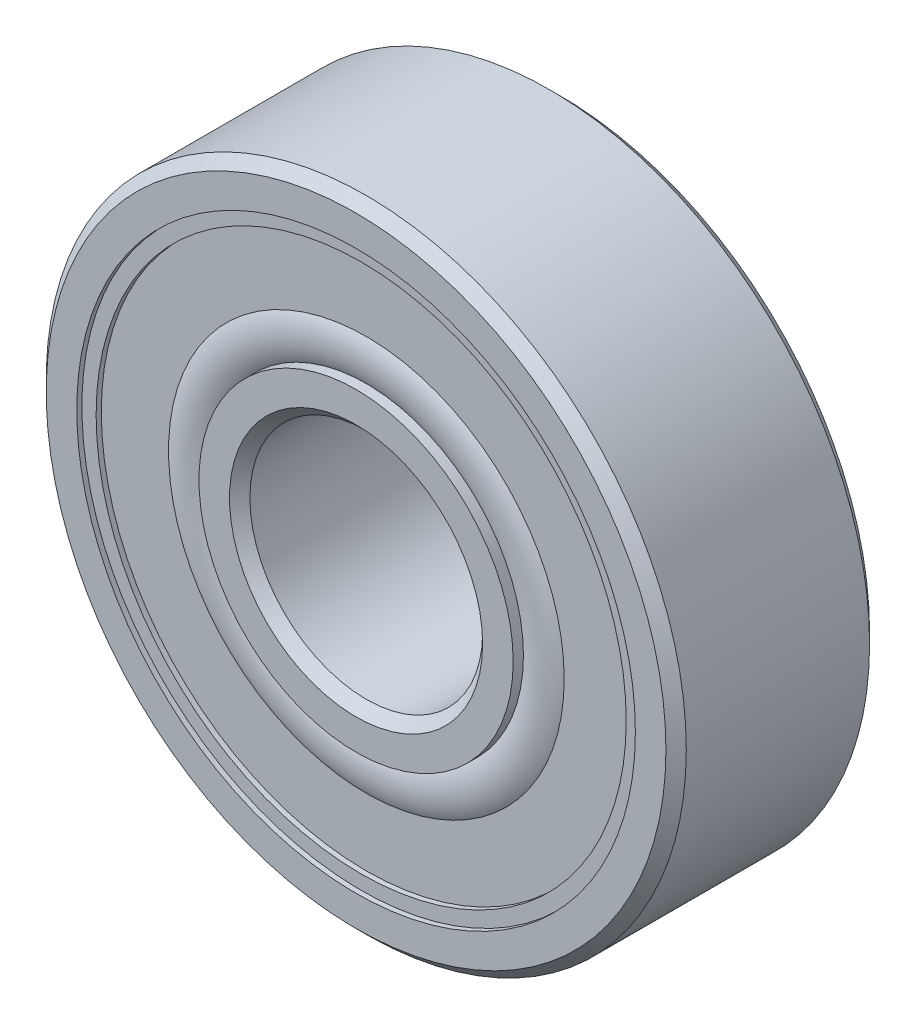
ISO-10303-21;
HEADER;
FILE_DESCRIPTION(('STEP AP214'),'2;1');
FILE_NAME('part.step','',(''),(''),'','','');
FILE_SCHEMA(('AUTOMOTIVE_DESIGN { 1 0 10303 214 1 1 1 1 }'));
ENDSEC;
DATA;
#1=APPLICATION_CONTEXT('core data for automotive mechanical design processes');
#2=APPLICATION_PROTOCOL_DEFINITION('international standard','automotive_design',2000,#1);
#3=PRODUCT_CONTEXT('',#1,'mechanical');
#4=PRODUCT('Part','Part','',(#3));
#5=PRODUCT_RELATED_PRODUCT_CATEGORY('part','',(#4));
#6=PRODUCT_DEFINITION_FORMATION('','',#4);
#7=PRODUCT_DEFINITION_CONTEXT('part definition',#1,'design');
#8=PRODUCT_DEFINITION('design','',#6,#7);
#9=PRODUCT_DEFINITION_SHAPE('','',#8);
#10=(LENGTH_UNIT() NAMED_UNIT(*) SI_UNIT(.MILLI.,.METRE.));
#11=(NAMED_UNIT(*) PLANE_ANGLE_UNIT() SI_UNIT($,.RADIAN.));
#12=(NAMED_UNIT(*) SI_UNIT($,.STERADIAN.) SOLID_ANGLE_UNIT());
#13=UNCERTAINTY_MEASURE_WITH_UNIT(LENGTH_MEASURE(1.E-05),#10,'distance_accuracy_value','');
#14=(GEOMETRIC_REPRESENTATION_CONTEXT(3) GLOBAL_UNCERTAINTY_ASSIGNED_CONTEXT((#13)) GLOBAL_UNIT_ASSIGNED_CONTEXT((#10,
#11,#12)) REPRESENTATION_CONTEXT('',''));
#15=CARTESIAN_POINT('',(0.,0.,0.));
#16=DIRECTION('',(0.,0.,1.));
#17=DIRECTION('',(1.,0.,0.));
#18=AXIS2_PLACEMENT_3D('',#15,#16,#17);
#19=CARTESIAN_POINT('',(0.,0.,-1.85890868663651));
#20=DIRECTION('',(0.,0.,1.));
#21=DIRECTION('',(1.,0.,0.));
#22=AXIS2_PLACEMENT_3D('',#19,#20,#21);
#23=TOROIDAL_SURFACE('',#22,6.10000000000001,1.46609131336349);
#24=CARTESIAN_POINT('',(0.,0.,-3.14709490730489));
#25=DIRECTION('',(0.,0.,1.));
#26=DIRECTION('',(1.,0.,0.));
#27=AXIS2_PLACEMENT_3D('',#24,#25,#26);
#28=CIRCLE('',#27,6.80000000000001);
#29=CARTESIAN_POINT('',(6.80000000000001,0.,-3.14709490730489));
#30=VERTEX_POINT('',#29);
#31=EDGE_CURVE('E11',#30,#30,#28,.T.);
#32=ORIENTED_EDGE('',*,*,#31,.F.);
#33=EDGE_LOOP('',(#32));
#34=FACE_BOUND('',#33,.T.);
#35=CARTESIAN_POINT('',(0.,0.,-3.14709490730489));
#36=DIRECTION('',(0.,0.,1.));
#37=DIRECTION('',(1.,0.,0.));
#38=AXIS2_PLACEMENT_3D('',#35,#36,#37);
#39=CIRCLE('',#38,5.40000000000001);
#40=CARTESIAN_POINT('',(5.40000000000001,0.,-3.14709490730489));
#41=VERTEX_POINT('',#40);
#42=EDGE_CURVE('E71',#41,#41,#39,.T.);
#43=ORIENTED_EDGE('',*,*,#42,.T.);
#44=EDGE_LOOP('',(#43));
#45=FACE_BOUND('',#44,.T.);
#46=ADVANCED_FACE('F46',(#34,#45),#23,.T.);
#47=CARTESIAN_POINT('',(0.,9.10999999999999,-3.14709490730489));
#48=DIRECTION('',(0.,0.,1.));
#49=DIRECTION('',(1.,0.,0.));
#50=AXIS2_PLACEMENT_3D('',#47,#48,#49);
#51=PLANE('',#50);
#52=CARTESIAN_POINT('',(0.,0.,-3.14709490730489));
#53=DIRECTION('',(0.,0.,1.));
#54=DIRECTION('',(1.,0.,0.));
#55=AXIS2_PLACEMENT_3D('',#52,#53,#54);
#56=CIRCLE('',#55,9.10999999999999);
#57=CARTESIAN_POINT('',(9.10999999999999,0.,-3.14709490730489));
#58=VERTEX_POINT('',#57);
#59=EDGE_CURVE('E52',#58,#58,#56,.T.);
#60=ORIENTED_EDGE('',*,*,#59,.F.);
#61=EDGE_LOOP('',(#60));
#62=FACE_BOUND('',#61,.T.);
#63=ORIENTED_EDGE('',*,*,#31,.T.);
#64=EDGE_LOOP('',(#63));
#65=FACE_BOUND('',#64,.T.);
#66=ADVANCED_FACE('F102',(#62,#65),#51,.F.);
#67=CARTESIAN_POINT('',(0.,0.,3.5));
#68=DIRECTION('',(0.,0.,1.));
#69=DIRECTION('',(1.,0.,0.));
#70=AXIS2_PLACEMENT_3D('',#67,#68,#69);
#71=CYLINDRICAL_SURFACE('',#70,9.10999999999999);
#72=CARTESIAN_POINT('',(0.,0.,-3.325));
#73=DIRECTION('',(0.,0.,1.));
#74=DIRECTION('',(1.,0.,0.));
#75=AXIS2_PLACEMENT_3D('',#72,#73,#74);
#76=CIRCLE('',#75,9.10999999999999);
#77=CARTESIAN_POINT('',(9.10999999999999,0.,-3.325));
#78=VERTEX_POINT('',#77);
#79=EDGE_CURVE('E56',#78,#78,#76,.T.);
#80=ORIENTED_EDGE('',*,*,#79,.F.);
#81=EDGE_LOOP('',(#80));
#82=FACE_BOUND('',#81,.T.);
#83=ORIENTED_EDGE('',*,*,#59,.T.);
#84=EDGE_LOOP('',(#83));
#85=FACE_BOUND('',#84,.T.);
#86=ADVANCED_FACE('F97',(#82,#85),#71,.F.);
#87=CARTESIAN_POINT('',(0.,9.59999999999999,-3.325));
#88=DIRECTION('',(0.,0.,1.));
#89=DIRECTION('',(1.,0.,0.));
#90=AXIS2_PLACEMENT_3D('',#87,#88,#89);
#91=PLANE('',#90);
#92=CARTESIAN_POINT('',(0.,0.,-3.325));
#93=DIRECTION('',(0.,0.,1.));
#94=DIRECTION('',(1.,0.,0.));
#95=AXIS2_PLACEMENT_3D('',#92,#93,#94);
#96=CIRCLE('',#95,9.59999999999999);
#97=CARTESIAN_POINT('',(9.59999999999999,0.,-3.325));
#98=VERTEX_POINT('',#97);
#99=EDGE_CURVE('E60',#98,#98,#96,.T.);
#100=ORIENTED_EDGE('',*,*,#99,.F.);
#101=EDGE_LOOP('',(#100));
#102=FACE_BOUND('',#101,.T.);
#103=ORIENTED_EDGE('',*,*,#79,.T.);
#104=EDGE_LOOP('',(#103));
#105=FACE_BOUND('',#104,.T.);
#106=ADVANCED_FACE('F91',(#102,#105),#91,.F.);
#107=CARTESIAN_POINT('',(0.,0.,3.5));
#108=DIRECTION('',(0.,0.,1.));
#109=DIRECTION('',(1.,0.,0.));
#110=AXIS2_PLACEMENT_3D('',#107,#108,#109);
#111=CYLINDRICAL_SURFACE('',#110,9.59999999999999);
#112=CARTESIAN_POINT('',(0.,0.,-2.61337962921956));
#113=DIRECTION('',(0.,0.,1.));
#114=DIRECTION('',(1.,0.,0.));
#115=AXIS2_PLACEMENT_3D('',#112,#113,#114);
#116=CIRCLE('',#115,9.59999999999999);
#117=CARTESIAN_POINT('',(9.59999999999999,0.,-2.61337962921956));
#118=VERTEX_POINT('',#117);
#119=EDGE_CURVE('E65',#118,#118,#116,.T.);
#120=ORIENTED_EDGE('',*,*,#119,.F.);
#121=EDGE_LOOP('',(#120));
#122=FACE_BOUND('',#121,.T.);
#123=ORIENTED_EDGE('',*,*,#99,.T.);
#124=EDGE_LOOP('',(#123));
#125=FACE_BOUND('',#124,.T.);
#126=ADVANCED_FACE('F85',(#122,#125),#111,.T.);
#127=CARTESIAN_POINT('',(0.,9.59999999999999,-2.61337962921956));
#128=DIRECTION('',(0.,0.,-1.));
#129=DIRECTION('',(-1.,0.,0.));
#130=AXIS2_PLACEMENT_3D('',#127,#128,#129);
#131=PLANE('',#130);
#132=CARTESIAN_POINT('',(0.,0.,-2.61337962921956));
#133=DIRECTION('',(0.,0.,1.));
#134=DIRECTION('',(1.,0.,0.));
#135=AXIS2_PLACEMENT_3D('',#132,#133,#134);
#136=CIRCLE('',#135,5.40000000000001);
#137=CARTESIAN_POINT('',(5.40000000000001,0.,-2.61337962921956));
#138=VERTEX_POINT('',#137);
#139=EDGE_CURVE('E68',#138,#138,#136,.T.);
#140=ORIENTED_EDGE('',*,*,#139,.F.);
#141=EDGE_LOOP('',(#140));
#142=FACE_BOUND('',#141,.T.);
#143=ORIENTED_EDGE('',*,*,#119,.T.);
#144=EDGE_LOOP('',(#143));
#145=FACE_BOUND('',#144,.T.);
#146=ADVANCED_FACE('F79',(#142,#145),#131,.F.);
#147=CARTESIAN_POINT('',(0.,0.,3.5));
#148=DIRECTION('',(0.,0.,1.));
#149=DIRECTION('',(1.,0.,0.));
#150=AXIS2_PLACEMENT_3D('',#147,#148,#149);
#151=CYLINDRICAL_SURFACE('',#150,5.40000000000001);
#152=ORIENTED_EDGE('',*,*,#42,.F.);
#153=EDGE_LOOP('',(#152));
#154=FACE_BOUND('',#153,.T.);
#155=ORIENTED_EDGE('',*,*,#139,.T.);
#156=EDGE_LOOP('',(#155));
#157=FACE_BOUND('',#156,.T.);
#158=ADVANCED_FACE('F76',(#154,#157),#151,.F.);
#159=CLOSED_SHELL('',(#46,#66,#86,#106,#126,#146,#158));
#160=MANIFOLD_SOLID_BREP('B2',#159);
#161=CARTESIAN_POINT('',(0.,9.59999999999999,3.325));
#162=DIRECTION('',(0.,0.,-1.));
#163=DIRECTION('',(-1.,0.,0.));
#164=AXIS2_PLACEMENT_3D('',#161,#162,#163);
#165=PLANE('',#164);
#166=CARTESIAN_POINT('',(0.,0.,3.325));
#167=DIRECTION('',(0.,0.,1.));
#168=DIRECTION('',(1.,0.,0.));
#169=AXIS2_PLACEMENT_3D('',#166,#167,#168);
#170=CIRCLE('',#169,9.10999999999999);
#171=CARTESIAN_POINT('',(9.10999999999999,0.,3.325));
#172=VERTEX_POINT('',#171);
#173=EDGE_CURVE('E170',#172,#172,#170,.T.);
#174=ORIENTED_EDGE('',*,*,#173,.F.);
#175=EDGE_LOOP('',(#174));
#176=FACE_BOUND('',#175,.T.);
#177=CARTESIAN_POINT('',(0.,0.,3.325));
#178=DIRECTION('',(0.,0.,1.));
#179=DIRECTION('',(1.,0.,0.));
#180=AXIS2_PLACEMENT_3D('',#177,#178,#179);
#181=CIRCLE('',#180,9.59999999999999);
#182=CARTESIAN_POINT('',(9.59999999999999,0.,3.325));
#183=VERTEX_POINT('',#182);
#184=EDGE_CURVE('E45',#183,#183,#181,.T.);
#185=ORIENTED_EDGE('',*,*,#184,.T.);
#186=EDGE_LOOP('',(#185));
#187=FACE_BOUND('',#186,.T.);
#188=ADVANCED_FACE('F145',(#176,#187),#165,.F.);
#189=CARTESIAN_POINT('',(0.,0.,3.5));
#190=DIRECTION('',(0.,0.,1.));
#191=DIRECTION('',(1.,0.,0.));
#192=AXIS2_PLACEMENT_3D('',#189,#190,#191);
#193=CYLINDRICAL_SURFACE('',#192,9.59999999999999);
#194=ORIENTED_EDGE('',*,*,#184,.F.);
#195=EDGE_LOOP('',(#194));
#196=FACE_BOUND('',#195,.T.);
#197=CARTESIAN_POINT('',(0.,0.,2.61337962921956));
#198=DIRECTION('',(0.,0.,1.));
#199=DIRECTION('',(1.,0.,0.));
#200=AXIS2_PLACEMENT_3D('',#197,#198,#199);
#201=CIRCLE('',#200,9.59999999999999);
#202=CARTESIAN_POINT('',(9.59999999999999,0.,2.61337962921956));
#203=VERTEX_POINT('',#202);
#204=EDGE_CURVE('E151',#203,#203,#201,.T.);
#205=ORIENTED_EDGE('',*,*,#204,.T.);
#206=EDGE_LOOP('',(#205));
#207=FACE_BOUND('',#206,.T.);
#208=ADVANCED_FACE('F177',(#196,#207),#193,.T.);
#209=CARTESIAN_POINT('',(0.,9.59999999999999,2.61337962921956));
#210=DIRECTION('',(0.,0.,1.));
#211=DIRECTION('',(1.,0.,0.));
#212=AXIS2_PLACEMENT_3D('',#209,#210,#211);
#213=PLANE('',#212);
#214=ORIENTED_EDGE('',*,*,#204,.F.);
#215=EDGE_LOOP('',(#214));
#216=FACE_BOUND('',#215,.T.);
#217=CARTESIAN_POINT('',(0.,0.,2.61337962921956));
#218=DIRECTION('',(0.,0.,1.));
#219=DIRECTION('',(1.,0.,0.));
#220=AXIS2_PLACEMENT_3D('',#217,#218,#219);
#221=CIRCLE('',#220,5.40000000000001);
#222=CARTESIAN_POINT('',(5.40000000000001,0.,2.61337962921956));
#223=VERTEX_POINT('',#222);
#224=EDGE_CURVE('E155',#223,#223,#221,.T.);
#225=ORIENTED_EDGE('',*,*,#224,.T.);
#226=EDGE_LOOP('',(#225));
#227=FACE_BOUND('',#226,.T.);
#228=ADVANCED_FACE('F181',(#216,#227),#213,.F.);
#229=CARTESIAN_POINT('',(0.,0.,3.5));
#230=DIRECTION('',(0.,0.,1.));
#231=DIRECTION('',(1.,0.,0.));
#232=AXIS2_PLACEMENT_3D('',#229,#230,#231);
#233=CYLINDRICAL_SURFACE('',#232,5.40000000000001);
#234=ORIENTED_EDGE('',*,*,#224,.F.);
#235=EDGE_LOOP('',(#234));
#236=FACE_BOUND('',#235,.T.);
#237=CARTESIAN_POINT('',(0.,0.,3.14709490730489));
#238=DIRECTION('',(0.,0.,1.));
#239=DIRECTION('',(1.,0.,0.));
#240=AXIS2_PLACEMENT_3D('',#237,#238,#239);
#241=CIRCLE('',#240,5.40000000000001);
#242=CARTESIAN_POINT('',(5.40000000000001,0.,3.14709490730489));
#243=VERTEX_POINT('',#242);
#244=EDGE_CURVE('E159',#243,#243,#241,.T.);
#245=ORIENTED_EDGE('',*,*,#244,.T.);
#246=EDGE_LOOP('',(#245));
#247=FACE_BOUND('',#246,.T.);
#248=ADVANCED_FACE('F186',(#236,#247),#233,.F.);
#249=CARTESIAN_POINT('',(0.,0.,1.85890868663651));
#250=DIRECTION('',(0.,0.,1.));
#251=DIRECTION('',(1.,0.,0.));
#252=AXIS2_PLACEMENT_3D('',#249,#250,#251);
#253=TOROIDAL_SURFACE('',#252,6.10000000000001,1.46609131336349);
#254=ORIENTED_EDGE('',*,*,#244,.F.);
#255=EDGE_LOOP('',(#254));
#256=FACE_BOUND('',#255,.T.);
#257=CARTESIAN_POINT('',(0.,0.,3.14709490730489));
#258=DIRECTION('',(0.,0.,1.));
#259=DIRECTION('',(1.,0.,0.));
#260=AXIS2_PLACEMENT_3D('',#257,#258,#259);
#261=CIRCLE('',#260,6.80000000000001);
#262=CARTESIAN_POINT('',(6.80000000000001,0.,3.14709490730489));
#263=VERTEX_POINT('',#262);
#264=EDGE_CURVE('E164',#263,#263,#261,.T.);
#265=ORIENTED_EDGE('',*,*,#264,.T.);
#266=EDGE_LOOP('',(#265));
#267=FACE_BOUND('',#266,.T.);
#268=ADVANCED_FACE('F192',(#256,#267),#253,.T.);
#269=CARTESIAN_POINT('',(0.,9.10999999999999,3.14709490730489));
#270=DIRECTION('',(0.,0.,-1.));
#271=DIRECTION('',(-1.,0.,0.));
#272=AXIS2_PLACEMENT_3D('',#269,#270,#271);
#273=PLANE('',#272);
#274=ORIENTED_EDGE('',*,*,#264,.F.);
#275=EDGE_LOOP('',(#274));
#276=FACE_BOUND('',#275,.T.);
#277=CARTESIAN_POINT('',(0.,0.,3.14709490730489));
#278=DIRECTION('',(0.,0.,1.));
#279=DIRECTION('',(1.,0.,0.));
#280=AXIS2_PLACEMENT_3D('',#277,#278,#279);
#281=CIRCLE('',#280,9.10999999999999);
#282=CARTESIAN_POINT('',(9.10999999999999,0.,3.14709490730489));
#283=VERTEX_POINT('',#282);
#284=EDGE_CURVE('E167',#283,#283,#281,.T.);
#285=ORIENTED_EDGE('',*,*,#284,.T.);
#286=EDGE_LOOP('',(#285));
#287=FACE_BOUND('',#286,.T.);
#288=ADVANCED_FACE('F196',(#276,#287),#273,.F.);
#289=CARTESIAN_POINT('',(0.,0.,3.5));
#290=DIRECTION('',(0.,0.,1.));
#291=DIRECTION('',(1.,0.,0.));
#292=AXIS2_PLACEMENT_3D('',#289,#290,#291);
#293=CYLINDRICAL_SURFACE('',#292,9.10999999999999);
#294=ORIENTED_EDGE('',*,*,#284,.F.);
#295=EDGE_LOOP('',(#294));
#296=FACE_BOUND('',#295,.T.);
#297=ORIENTED_EDGE('',*,*,#173,.T.);
#298=EDGE_LOOP('',(#297));
#299=FACE_BOUND('',#298,.T.);
#300=ADVANCED_FACE('F174',(#296,#299),#293,.F.);
#301=CLOSED_SHELL('',(#188,#208,#228,#248,#268,#288,#300));
#302=MANIFOLD_SOLID_BREP('B6',#301);
#303=CARTESIAN_POINT('',(-5.86373611851017,4.67617351394057,0.));
#304=DIRECTION('',(0.,0.,1.));
#305=DIRECTION('',(-0.781831482468022,0.623489801858743,0.));
#306=AXIS2_PLACEMENT_3D('',#303,#304,#305);
#307=SPHERICAL_SURFACE('',#306,2.61337962921956);
#308=CARTESIAN_POINT('',(-5.86373611851017,4.67617351394057,2.61337962921956));
#309=VERTEX_POINT('',#308);
#310=VERTEX_LOOP('',#309);
#311=FACE_BOUND('',#310,.T.);
#312=ADVANCED_FACE('F244',(#311),#307,.T.);
#313=CLOSED_SHELL('',(#312));
#314=MANIFOLD_SOLID_BREP('B40',#313);
#315=CARTESIAN_POINT('',(-7.31195934136369,-1.66890700467229,0.));
#316=DIRECTION('',(0.,0.,1.));
#317=DIRECTION('',(-0.974927912181826,-0.222520933956305,0.));
#318=AXIS2_PLACEMENT_3D('',#315,#316,#317);
#319=SPHERICAL_SURFACE('',#318,2.61337962921956);
#320=CARTESIAN_POINT('',(-7.31195934136369,-1.66890700467229,2.61337962921956));
#321=VERTEX_POINT('',#320);
#322=VERTEX_LOOP('',#321);
#323=FACE_BOUND('',#322,.T.);
#324=ADVANCED_FACE('F261',(#323),#319,.T.);
#325=CLOSED_SHELL('',(#324));
#326=MANIFOLD_SOLID_BREP('B141',#325);
#327=CARTESIAN_POINT('',(-3.25412804338174,-6.75726650926812,0.));
#328=DIRECTION('',(0.,0.,1.));
#329=DIRECTION('',(-0.433883739117565,-0.900968867902416,0.));
#330=AXIS2_PLACEMENT_3D('',#327,#328,#329);
#331=SPHERICAL_SURFACE('',#330,2.61337962921956);
#332=CARTESIAN_POINT('',(-3.25412804338174,-6.75726650926812,2.61337962921956));
#333=VERTEX_POINT('',#332);
#334=VERTEX_LOOP('',#333);
#335=FACE_BOUND('',#334,.T.);
#336=ADVANCED_FACE('F278',(#335),#331,.T.);
#337=CLOSED_SHELL('',(#336));
#338=MANIFOLD_SOLID_BREP('B240',#337);
#339=CARTESIAN_POINT('',(3.25412804338164,-6.75726650926816,0.));
#340=DIRECTION('',(0.,0.,1.));
#341=DIRECTION('',(0.433883739117553,-0.900968867902422,0.));
#342=AXIS2_PLACEMENT_3D('',#339,#340,#341);
#343=SPHERICAL_SURFACE('',#342,2.61337962921956);
#344=CARTESIAN_POINT('',(3.25412804338164,-6.75726650926816,2.61337962921956));
#345=VERTEX_POINT('',#344);
#346=VERTEX_LOOP('',#345);
#347=FACE_BOUND('',#346,.T.);
#348=ADVANCED_FACE('F295',(#347),#343,.T.);
#349=CLOSED_SHELL('',(#348));
#350=MANIFOLD_SOLID_BREP('B257',#349);
#351=CARTESIAN_POINT('',(7.31195934136367,-1.66890700467239,0.));
#352=DIRECTION('',(0.,0.,1.));
#353=DIRECTION('',(0.974927912181823,-0.222520933956318,0.));
#354=AXIS2_PLACEMENT_3D('',#351,#352,#353);
#355=SPHERICAL_SURFACE('',#354,2.61337962921956);
#356=CARTESIAN_POINT('',(7.31195934136367,-1.66890700467239,2.61337962921956));
#357=VERTEX_POINT('',#356);
#358=VERTEX_LOOP('',#357);
#359=FACE_BOUND('',#358,.T.);
#360=ADVANCED_FACE('F312',(#359),#355,.T.);
#361=CLOSED_SHELL('',(#360));
#362=MANIFOLD_SOLID_BREP('B274',#361);
#363=CARTESIAN_POINT('',(5.86373611851023,4.67617351394049,0.));
#364=DIRECTION('',(0.,0.,1.));
#365=DIRECTION('',(0.781831482468031,0.623489801858732,0.));
#366=AXIS2_PLACEMENT_3D('',#363,#364,#365);
#367=SPHERICAL_SURFACE('',#366,2.61337962921956);
#368=CARTESIAN_POINT('',(5.86373611851023,4.67617351394049,2.61337962921956));
#369=VERTEX_POINT('',#368);
#370=VERTEX_LOOP('',#369);
#371=FACE_BOUND('',#370,.T.);
#372=ADVANCED_FACE('F329',(#371),#367,.T.);
#373=CLOSED_SHELL('',(#372));
#374=MANIFOLD_SOLID_BREP('B291',#373);
#375=CARTESIAN_POINT('',(0.,7.5,0.));
#376=DIRECTION('',(0.,0.,1.));
#377=DIRECTION('',(0.,1.,0.));
#378=AXIS2_PLACEMENT_3D('',#375,#376,#377);
#379=SPHERICAL_SURFACE('',#378,2.61337962921956);
#380=CARTESIAN_POINT('',(0.,7.5,2.61337962921956));
#381=VERTEX_POINT('',#380);
#382=VERTEX_LOOP('',#381);
#383=FACE_BOUND('',#382,.T.);
#384=ADVANCED_FACE('F348',(#383),#379,.T.);
#385=CLOSED_SHELL('',(#384));
#386=MANIFOLD_SOLID_BREP('B308',#385);
#387=CARTESIAN_POINT('',(0.,0.,3.5));
#388=DIRECTION('',(0.,0.,1.));
#389=DIRECTION('',(1.,0.,0.));
#390=AXIS2_PLACEMENT_3D('',#387,#388,#389);
#391=CONICAL_SURFACE('',#390,4.35,0.785398163397449);
#392=CARTESIAN_POINT('',(0.,0.,3.15));
#393=DIRECTION('',(0.,0.,1.));
#394=DIRECTION('',(1.,0.,0.));
#395=AXIS2_PLACEMENT_3D('',#392,#393,#394);
#396=CIRCLE('',#395,4.);
#397=CARTESIAN_POINT('',(4.,0.,3.15));
#398=VERTEX_POINT('',#397);
#399=EDGE_CURVE('E347',#398,#398,#396,.T.);
#400=ORIENTED_EDGE('',*,*,#399,.F.);
#401=EDGE_LOOP('',(#400));
#402=FACE_BOUND('',#401,.T.);
#403=CARTESIAN_POINT('',(0.,0.,3.5));
#404=DIRECTION('',(0.,0.,1.));
#405=DIRECTION('',(1.,0.,0.));
#406=AXIS2_PLACEMENT_3D('',#403,#404,#405);
#407=CIRCLE('',#406,4.35);
#408=CARTESIAN_POINT('',(4.35,0.,3.5));
#409=VERTEX_POINT('',#408);
#410=EDGE_CURVE('E394',#409,#409,#407,.T.);
#411=ORIENTED_EDGE('',*,*,#410,.T.);
#412=EDGE_LOOP('',(#411));
#413=FACE_BOUND('',#412,.T.);
#414=ADVANCED_FACE('F366',(#402,#413),#391,.F.);
#415=CARTESIAN_POINT('',(0.,0.,3.5));
#416=DIRECTION('',(0.,0.,1.));
#417=DIRECTION('',(1.,0.,0.));
#418=AXIS2_PLACEMENT_3D('',#415,#416,#417);
#419=CYLINDRICAL_SURFACE('',#418,4.);
#420=CARTESIAN_POINT('',(0.,0.,-3.15));
#421=DIRECTION('',(0.,0.,1.));
#422=DIRECTION('',(1.,0.,0.));
#423=AXIS2_PLACEMENT_3D('',#420,#421,#422);
#424=CIRCLE('',#423,4.);
#425=CARTESIAN_POINT('',(4.,0.,-3.15));
#426=VERTEX_POINT('',#425);
#427=EDGE_CURVE('E372',#426,#426,#424,.T.);
#428=ORIENTED_EDGE('',*,*,#427,.F.);
#429=EDGE_LOOP('',(#428));
#430=FACE_BOUND('',#429,.T.);
#431=ORIENTED_EDGE('',*,*,#399,.T.);
#432=EDGE_LOOP('',(#431));
#433=FACE_BOUND('',#432,.T.);
#434=ADVANCED_FACE('F431',(#430,#433),#419,.F.);
#435=CARTESIAN_POINT('',(0.,0.,-3.15));
#436=DIRECTION('',(0.,0.,-1.));
#437=DIRECTION('',(-1.,0.,0.));
#438=AXIS2_PLACEMENT_3D('',#435,#436,#437);
#439=CONICAL_SURFACE('',#438,4.,0.785398163397447);
#440=CARTESIAN_POINT('',(0.,0.,-3.5));
#441=DIRECTION('',(0.,0.,1.));
#442=DIRECTION('',(1.,0.,0.));
#443=AXIS2_PLACEMENT_3D('',#440,#441,#442);
#444=CIRCLE('',#443,4.35);
#445=CARTESIAN_POINT('',(4.35,0.,-3.5));
#446=VERTEX_POINT('',#445);
#447=EDGE_CURVE('E376',#446,#446,#444,.T.);
#448=ORIENTED_EDGE('',*,*,#447,.F.);
#449=EDGE_LOOP('',(#448));
#450=FACE_BOUND('',#449,.T.);
#451=ORIENTED_EDGE('',*,*,#427,.T.);
#452=EDGE_LOOP('',(#451));
#453=FACE_BOUND('',#452,.T.);
#454=ADVANCED_FACE('F426',(#450,#453),#439,.F.);
#455=CARTESIAN_POINT('',(0.,4.35,-3.5));
#456=DIRECTION('',(0.,0.,1.));
#457=DIRECTION('',(1.,0.,0.));
#458=AXIS2_PLACEMENT_3D('',#455,#456,#457);
#459=PLANE('',#458);
#460=CARTESIAN_POINT('',(0.,0.,-3.5));
#461=DIRECTION('',(0.,0.,1.));
#462=DIRECTION('',(1.,0.,0.));
#463=AXIS2_PLACEMENT_3D('',#460,#461,#462);
#464=CIRCLE('',#463,5.40000000000001);
#465=CARTESIAN_POINT('',(5.40000000000001,0.,-3.5));
#466=VERTEX_POINT('',#465);
#467=EDGE_CURVE('E380',#466,#466,#464,.T.);
#468=ORIENTED_EDGE('',*,*,#467,.F.);
#469=EDGE_LOOP('',(#468));
#470=FACE_BOUND('',#469,.T.);
#471=ORIENTED_EDGE('',*,*,#447,.T.);
#472=EDGE_LOOP('',(#471));
#473=FACE_BOUND('',#472,.T.);
#474=ADVANCED_FACE('F420',(#470,#473),#459,.F.);
#475=CARTESIAN_POINT('',(0.,0.,3.5));
#476=DIRECTION('',(0.,0.,1.));
#477=DIRECTION('',(1.,0.,0.));
#478=AXIS2_PLACEMENT_3D('',#475,#476,#477);
#479=CYLINDRICAL_SURFACE('',#478,5.4);
#480=CARTESIAN_POINT('',(0.,0.,-1.55555555555556));
#481=DIRECTION('',(0.,0.,1.));
#482=DIRECTION('',(1.,0.,0.));
#483=AXIS2_PLACEMENT_3D('',#480,#481,#482);
#484=CIRCLE('',#483,5.4);
#485=CARTESIAN_POINT('',(5.4,0.,-1.55555555555556));
#486=VERTEX_POINT('',#485);
#487=EDGE_CURVE('E385',#486,#486,#484,.T.);
#488=ORIENTED_EDGE('',*,*,#487,.F.);
#489=EDGE_LOOP('',(#488));
#490=FACE_BOUND('',#489,.T.);
#491=ORIENTED_EDGE('',*,*,#467,.T.);
#492=EDGE_LOOP('',(#491));
#493=FACE_BOUND('',#492,.T.);
#494=ADVANCED_FACE('F414',(#490,#493),#479,.T.);
#495=CARTESIAN_POINT('',(0.,0.,0.));
#496=DIRECTION('',(0.,0.,1.));
#497=DIRECTION('',(1.,0.,0.));
#498=AXIS2_PLACEMENT_3D('',#495,#496,#497);
#499=TOROIDAL_SURFACE('',#498,7.5,2.61337962921956);
#500=CARTESIAN_POINT('',(0.,0.,1.55555555555556));
#501=DIRECTION('',(0.,0.,1.));
#502=DIRECTION('',(1.,0.,0.));
#503=AXIS2_PLACEMENT_3D('',#500,#501,#502);
#504=CIRCLE('',#503,5.4);
#505=CARTESIAN_POINT('',(5.4,0.,1.55555555555556));
#506=VERTEX_POINT('',#505);
#507=EDGE_CURVE('E388',#506,#506,#504,.T.);
#508=ORIENTED_EDGE('',*,*,#507,.F.);
#509=EDGE_LOOP('',(#508));
#510=FACE_BOUND('',#509,.T.);
#511=ORIENTED_EDGE('',*,*,#487,.T.);
#512=EDGE_LOOP('',(#511));
#513=FACE_BOUND('',#512,.T.);
#514=ADVANCED_FACE('F408',(#510,#513),#499,.F.);
#515=CARTESIAN_POINT('',(0.,0.,3.5));
#516=DIRECTION('',(0.,0.,1.));
#517=DIRECTION('',(1.,0.,0.));
#518=AXIS2_PLACEMENT_3D('',#515,#516,#517);
#519=CYLINDRICAL_SURFACE('',#518,5.4);
#520=CARTESIAN_POINT('',(0.,0.,3.5));
#521=DIRECTION('',(0.,0.,1.));
#522=DIRECTION('',(1.,0.,0.));
#523=AXIS2_PLACEMENT_3D('',#520,#521,#522);
#524=CIRCLE('',#523,5.40000000000001);
#525=CARTESIAN_POINT('',(5.40000000000001,0.,3.5));
#526=VERTEX_POINT('',#525);
#527=EDGE_CURVE('E391',#526,#526,#524,.T.);
#528=ORIENTED_EDGE('',*,*,#527,.F.);
#529=EDGE_LOOP('',(#528));
#530=FACE_BOUND('',#529,.T.);
#531=ORIENTED_EDGE('',*,*,#507,.T.);
#532=EDGE_LOOP('',(#531));
#533=FACE_BOUND('',#532,.T.);
#534=ADVANCED_FACE('F402',(#530,#533),#519,.T.);
#535=CARTESIAN_POINT('',(0.,4.35,3.5));
#536=DIRECTION('',(0.,0.,-1.));
#537=DIRECTION('',(-1.,0.,0.));
#538=AXIS2_PLACEMENT_3D('',#535,#536,#537);
#539=PLANE('',#538);
#540=ORIENTED_EDGE('',*,*,#410,.F.);
#541=EDGE_LOOP('',(#540));
#542=FACE_BOUND('',#541,.T.);
#543=ORIENTED_EDGE('',*,*,#527,.T.);
#544=EDGE_LOOP('',(#543));
#545=FACE_BOUND('',#544,.T.);
#546=ADVANCED_FACE('F399',(#542,#545),#539,.F.);
#547=CLOSED_SHELL('',(#414,#434,#454,#474,#494,#514,#534,#546));
#548=MANIFOLD_SOLID_BREP('B325',#547);
#549=CARTESIAN_POINT('',(0.,0.,3.15));
#550=DIRECTION('',(0.,0.,-1.));
#551=DIRECTION('',(-1.,0.,0.));
#552=AXIS2_PLACEMENT_3D('',#549,#550,#551);
#553=CONICAL_SURFACE('',#552,11.,0.785398163397447);
#554=CARTESIAN_POINT('',(0.,0.,3.5));
#555=DIRECTION('',(0.,0.,1.));
#556=DIRECTION('',(1.,0.,0.));
#557=AXIS2_PLACEMENT_3D('',#554,#555,#556);
#558=CIRCLE('',#557,10.65);
#559=CARTESIAN_POINT('',(10.65,0.,3.5));
#560=VERTEX_POINT('',#559);
#561=EDGE_CURVE('E365',#560,#560,#558,.T.);
#562=ORIENTED_EDGE('',*,*,#561,.F.);
#563=EDGE_LOOP('',(#562));
#564=FACE_BOUND('',#563,.T.);
#565=CARTESIAN_POINT('',(0.,0.,3.15));
#566=DIRECTION('',(0.,0.,1.));
#567=DIRECTION('',(1.,0.,0.));
#568=AXIS2_PLACEMENT_3D('',#565,#566,#567);
#569=CIRCLE('',#568,11.);
#570=CARTESIAN_POINT('',(11.,0.,3.15));
#571=VERTEX_POINT('',#570);
#572=EDGE_CURVE('E500',#571,#571,#569,.T.);
#573=ORIENTED_EDGE('',*,*,#572,.T.);
#574=EDGE_LOOP('',(#573));
#575=FACE_BOUND('',#574,.T.);
#576=ADVANCED_FACE('F472',(#564,#575),#553,.T.);
#577=CARTESIAN_POINT('',(0.,10.65,3.5));
#578=DIRECTION('',(0.,0.,-1.));
#579=DIRECTION('',(-1.,0.,0.));
#580=AXIS2_PLACEMENT_3D('',#577,#578,#579);
#581=PLANE('',#580);
#582=CARTESIAN_POINT('',(0.,0.,3.5));
#583=DIRECTION('',(0.,0.,1.));
#584=DIRECTION('',(1.,0.,0.));
#585=AXIS2_PLACEMENT_3D('',#582,#583,#584);
#586=CIRCLE('',#585,9.59999999999999);
#587=CARTESIAN_POINT('',(9.59999999999999,0.,3.5));
#588=VERTEX_POINT('',#587);
#589=EDGE_CURVE('E478',#588,#588,#586,.T.);
#590=ORIENTED_EDGE('',*,*,#589,.F.);
#591=EDGE_LOOP('',(#590));
#592=FACE_BOUND('',#591,.T.);
#593=ORIENTED_EDGE('',*,*,#561,.T.);
#594=EDGE_LOOP('',(#593));
#595=FACE_BOUND('',#594,.T.);
#596=ADVANCED_FACE('F537',(#592,#595),#581,.F.);
#597=CARTESIAN_POINT('',(0.,0.,3.5));
#598=DIRECTION('',(0.,0.,1.));
#599=DIRECTION('',(1.,0.,0.));
#600=AXIS2_PLACEMENT_3D('',#597,#598,#599);
#601=CYLINDRICAL_SURFACE('',#600,9.6);
#602=CARTESIAN_POINT('',(0.,0.,1.55555555555556));
#603=DIRECTION('',(0.,0.,1.));
#604=DIRECTION('',(1.,0.,0.));
#605=AXIS2_PLACEMENT_3D('',#602,#603,#604);
#606=CIRCLE('',#605,9.6);
#607=CARTESIAN_POINT('',(9.6,0.,1.55555555555556));
#608=VERTEX_POINT('',#607);
#609=EDGE_CURVE('E482',#608,#608,#606,.T.);
#610=ORIENTED_EDGE('',*,*,#609,.F.);
#611=EDGE_LOOP('',(#610));
#612=FACE_BOUND('',#611,.T.);
#613=ORIENTED_EDGE('',*,*,#589,.T.);
#614=EDGE_LOOP('',(#613));
#615=FACE_BOUND('',#614,.T.);
#616=ADVANCED_FACE('F532',(#612,#615),#601,.F.);
#617=CARTESIAN_POINT('',(0.,0.,0.));
#618=DIRECTION('',(0.,0.,1.));
#619=DIRECTION('',(1.,0.,0.));
#620=AXIS2_PLACEMENT_3D('',#617,#618,#619);
#621=TOROIDAL_SURFACE('',#620,7.5,2.61337962921956);
#622=CARTESIAN_POINT('',(0.,0.,-1.55555555555556));
#623=DIRECTION('',(0.,0.,1.));
#624=DIRECTION('',(1.,0.,0.));
#625=AXIS2_PLACEMENT_3D('',#622,#623,#624);
#626=CIRCLE('',#625,9.6);
#627=CARTESIAN_POINT('',(9.6,0.,-1.55555555555556));
#628=VERTEX_POINT('',#627);
#629=EDGE_CURVE('E486',#628,#628,#626,.T.);
#630=ORIENTED_EDGE('',*,*,#629,.F.);
#631=EDGE_LOOP('',(#630));
#632=FACE_BOUND('',#631,.T.);
#633=ORIENTED_EDGE('',*,*,#609,.T.);
#634=EDGE_LOOP('',(#633));
#635=FACE_BOUND('',#634,.T.);
#636=ADVANCED_FACE('F526',(#632,#635),#621,.F.);
#637=CARTESIAN_POINT('',(0.,0.,3.5));
#638=DIRECTION('',(0.,0.,1.));
#639=DIRECTION('',(1.,0.,0.));
#640=AXIS2_PLACEMENT_3D('',#637,#638,#639);
#641=CYLINDRICAL_SURFACE('',#640,9.6);
#642=CARTESIAN_POINT('',(0.,0.,-3.5));
#643=DIRECTION('',(0.,0.,1.));
#644=DIRECTION('',(1.,0.,0.));
#645=AXIS2_PLACEMENT_3D('',#642,#643,#644);
#646=CIRCLE('',#645,9.59999999999999);
#647=CARTESIAN_POINT('',(9.59999999999999,0.,-3.5));
#648=VERTEX_POINT('',#647);
#649=EDGE_CURVE('E491',#648,#648,#646,.T.);
#650=ORIENTED_EDGE('',*,*,#649,.F.);
#651=EDGE_LOOP('',(#650));
#652=FACE_BOUND('',#651,.T.);
#653=ORIENTED_EDGE('',*,*,#629,.T.);
#654=EDGE_LOOP('',(#653));
#655=FACE_BOUND('',#654,.T.);
#656=ADVANCED_FACE('F520',(#652,#655),#641,.F.);
#657=CARTESIAN_POINT('',(0.,10.65,-3.5));
#658=DIRECTION('',(0.,0.,1.));
#659=DIRECTION('',(1.,0.,0.));
#660=AXIS2_PLACEMENT_3D('',#657,#658,#659);
#661=PLANE('',#660);
#662=CARTESIAN_POINT('',(0.,0.,-3.5));
#663=DIRECTION('',(0.,0.,1.));
#664=DIRECTION('',(1.,0.,0.));
#665=AXIS2_PLACEMENT_3D('',#662,#663,#664);
#666=CIRCLE('',#665,10.65);
#667=CARTESIAN_POINT('',(10.65,0.,-3.5));
#668=VERTEX_POINT('',#667);
#669=EDGE_CURVE('E494',#668,#668,#666,.T.);
#670=ORIENTED_EDGE('',*,*,#669,.F.);
#671=EDGE_LOOP('',(#670));
#672=FACE_BOUND('',#671,.T.);
#673=ORIENTED_EDGE('',*,*,#649,.T.);
#674=EDGE_LOOP('',(#673));
#675=FACE_BOUND('',#674,.T.);
#676=ADVANCED_FACE('F514',(#672,#675),#661,.F.);
#677=CARTESIAN_POINT('',(0.,0.,-3.5));
#678=DIRECTION('',(0.,0.,1.));
#679=DIRECTION('',(1.,0.,0.));
#680=AXIS2_PLACEMENT_3D('',#677,#678,#679);
#681=CONICAL_SURFACE('',#680,10.65,0.785398163397442);
#682=CARTESIAN_POINT('',(0.,0.,-3.15));
#683=DIRECTION('',(0.,0.,1.));
#684=DIRECTION('',(1.,0.,0.));
#685=AXIS2_PLACEMENT_3D('',#682,#683,#684);
#686=CIRCLE('',#685,11.);
#687=CARTESIAN_POINT('',(11.,0.,-3.15));
#688=VERTEX_POINT('',#687);
#689=EDGE_CURVE('E497',#688,#688,#686,.T.);
#690=ORIENTED_EDGE('',*,*,#689,.F.);
#691=EDGE_LOOP('',(#690));
#692=FACE_BOUND('',#691,.T.);
#693=ORIENTED_EDGE('',*,*,#669,.T.);
#694=EDGE_LOOP('',(#693));
#695=FACE_BOUND('',#694,.T.);
#696=ADVANCED_FACE('F508',(#692,#695),#681,.T.);
#697=CARTESIAN_POINT('',(0.,0.,3.5));
#698=DIRECTION('',(0.,0.,1.));
#699=DIRECTION('',(1.,0.,0.));
#700=AXIS2_PLACEMENT_3D('',#697,#698,#699);
#701=CYLINDRICAL_SURFACE('',#700,11.);
#702=ORIENTED_EDGE('',*,*,#572,.F.);
#703=EDGE_LOOP('',(#702));
#704=FACE_BOUND('',#703,.T.);
#705=ORIENTED_EDGE('',*,*,#689,.T.);
#706=EDGE_LOOP('',(#705));
#707=FACE_BOUND('',#706,.T.);
#708=ADVANCED_FACE('F505',(#704,#707),#701,.T.);
#709=CLOSED_SHELL('',(#576,#596,#616,#636,#656,#676,#696,#708));
#710=MANIFOLD_SOLID_BREP('B342',#709);
#711=ADVANCED_BREP_SHAPE_REPRESENTATION('',(#18,#160,#302,#314,#326,#338,#350,#362,#374,#386,
#548,#710),#14);
#712=SHAPE_DEFINITION_REPRESENTATION(#9,#711);
ENDSEC;
END-ISO-10303-21;
